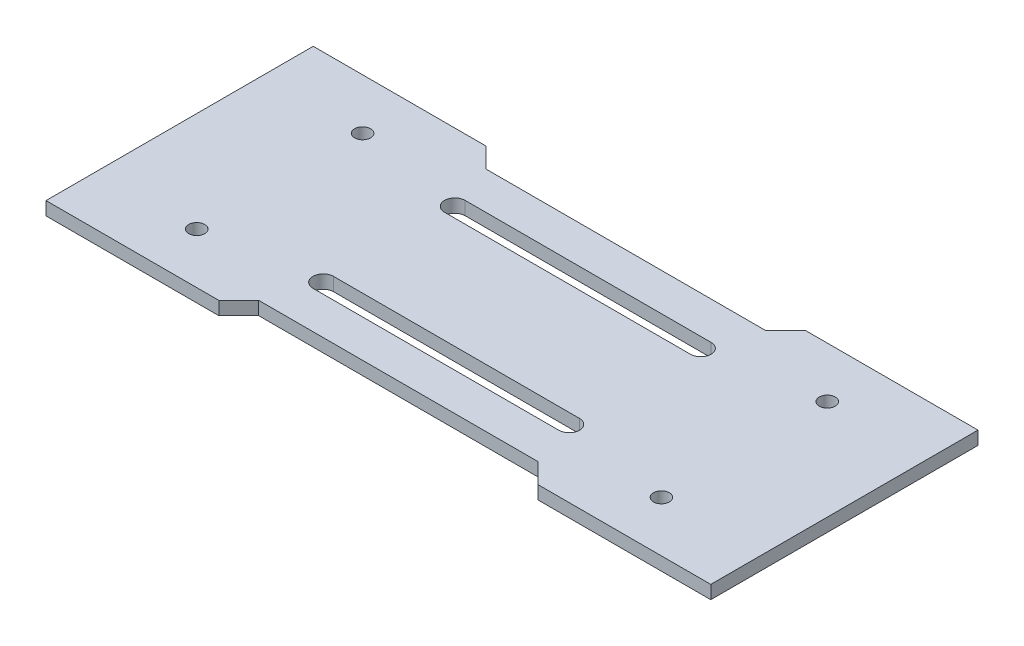
ISO-10303-21;
HEADER;
FILE_DESCRIPTION(('STEP AP214'),'2;1');
FILE_NAME('part.step','',(''),(''),'','','');
FILE_SCHEMA(('AUTOMOTIVE_DESIGN { 1 0 10303 214 1 1 1 1 }'));
ENDSEC;
DATA;
#1=APPLICATION_CONTEXT('core data for automotive mechanical design processes');
#2=APPLICATION_PROTOCOL_DEFINITION('international standard','automotive_design',2000,#1);
#3=PRODUCT_CONTEXT('',#1,'mechanical');
#4=PRODUCT('Part','Part','',(#3));
#5=PRODUCT_RELATED_PRODUCT_CATEGORY('part','',(#4));
#6=PRODUCT_DEFINITION_FORMATION('','',#4);
#7=PRODUCT_DEFINITION_CONTEXT('part definition',#1,'design');
#8=PRODUCT_DEFINITION('design','',#6,#7);
#9=PRODUCT_DEFINITION_SHAPE('','',#8);
#10=(LENGTH_UNIT() NAMED_UNIT(*) SI_UNIT(.MILLI.,.METRE.));
#11=(NAMED_UNIT(*) PLANE_ANGLE_UNIT() SI_UNIT($,.RADIAN.));
#12=(NAMED_UNIT(*) SI_UNIT($,.STERADIAN.) SOLID_ANGLE_UNIT());
#13=UNCERTAINTY_MEASURE_WITH_UNIT(LENGTH_MEASURE(1.E-05),#10,'distance_accuracy_value','');
#14=(GEOMETRIC_REPRESENTATION_CONTEXT(3) GLOBAL_UNCERTAINTY_ASSIGNED_CONTEXT((#13)) GLOBAL_UNIT_ASSIGNED_CONTEXT((#10,
#11,#12)) REPRESENTATION_CONTEXT('',''));
#15=CARTESIAN_POINT('',(0.,0.,0.));
#16=DIRECTION('',(0.,0.,1.));
#17=DIRECTION('',(1.,0.,0.));
#18=AXIS2_PLACEMENT_3D('',#15,#16,#17);
#19=CARTESIAN_POINT('',(-50.,1.,20.1));
#20=DIRECTION('',(0.,0.,-1.));
#21=DIRECTION('',(-1.,0.,0.));
#22=AXIS2_PLACEMENT_3D('',#19,#20,#21);
#23=PLANE('',#22);
#24=DIRECTION('',(1.,0.,0.));
#25=VECTOR('',#24,1.);
#26=CARTESIAN_POINT('',(-50.,-1.,20.1));
#27=LINE('',#26,#25);
#28=CARTESIAN_POINT('',(-50.,-1.,20.1));
#29=VERTEX_POINT('',#28);
#30=CARTESIAN_POINT('',(-24.,-1.,20.1));
#31=VERTEX_POINT('',#30);
#32=EDGE_CURVE('E190',#29,#31,#27,.T.);
#33=ORIENTED_EDGE('',*,*,#32,.T.);
#34=DIRECTION('',(0.,-1.,0.));
#35=VECTOR('',#34,1.);
#36=CARTESIAN_POINT('',(-24.,1.,20.1));
#37=LINE('',#36,#35);
#38=CARTESIAN_POINT('',(-24.,1.,20.1));
#39=VERTEX_POINT('',#38);
#40=EDGE_CURVE('E11',#39,#31,#37,.T.);
#41=ORIENTED_EDGE('',*,*,#40,.F.);
#42=DIRECTION('',(1.,0.,0.));
#43=VECTOR('',#42,1.);
#44=CARTESIAN_POINT('',(-50.,1.,20.1));
#45=LINE('',#44,#43);
#46=CARTESIAN_POINT('',(-50.,1.,20.1));
#47=VERTEX_POINT('',#46);
#48=EDGE_CURVE('E191',#47,#39,#45,.T.);
#49=ORIENTED_EDGE('',*,*,#48,.F.);
#50=DIRECTION('',(0.,-1.,0.));
#51=VECTOR('',#50,1.);
#52=CARTESIAN_POINT('',(-50.,1.,20.1));
#53=LINE('',#52,#51);
#54=EDGE_CURVE('E228',#47,#29,#53,.T.);
#55=ORIENTED_EDGE('',*,*,#54,.T.);
#56=EDGE_LOOP('',(#33,#41,#49,#55));
#57=FACE_BOUND('',#56,.T.);
#58=ADVANCED_FACE('F37',(#57),#23,.F.);
#59=CARTESIAN_POINT('',(-24.,1.,20.1));
#60=DIRECTION('',(-0.707106781186547,0.,-0.707106781186548));
#61=DIRECTION('',(-0.707106781186548,0.,0.707106781186547));
#62=AXIS2_PLACEMENT_3D('',#59,#60,#61);
#63=PLANE('',#62);
#64=DIRECTION('',(0.707106781186548,0.,-0.707106781186547));
#65=VECTOR('',#64,1.);
#66=CARTESIAN_POINT('',(-24.,-1.,20.1));
#67=LINE('',#66,#65);
#68=CARTESIAN_POINT('',(-21.,-1.,17.1));
#69=VERTEX_POINT('',#68);
#70=EDGE_CURVE('E91',#31,#69,#67,.T.);
#71=ORIENTED_EDGE('',*,*,#70,.T.);
#72=DIRECTION('',(0.,-1.,0.));
#73=VECTOR('',#72,1.);
#74=CARTESIAN_POINT('',(-21.,1.,17.1));
#75=LINE('',#74,#73);
#76=CARTESIAN_POINT('',(-21.,1.,17.1));
#77=VERTEX_POINT('',#76);
#78=EDGE_CURVE('E45',#77,#69,#75,.T.);
#79=ORIENTED_EDGE('',*,*,#78,.F.);
#80=DIRECTION('',(0.707106781186548,0.,-0.707106781186547));
#81=VECTOR('',#80,1.);
#82=CARTESIAN_POINT('',(-24.,1.,20.1));
#83=LINE('',#82,#81);
#84=EDGE_CURVE('E194',#39,#77,#83,.T.);
#85=ORIENTED_EDGE('',*,*,#84,.F.);
#86=ORIENTED_EDGE('',*,*,#40,.T.);
#87=EDGE_LOOP('',(#71,#79,#85,#86));
#88=FACE_BOUND('',#87,.T.);
#89=ADVANCED_FACE('F348',(#88),#63,.F.);
#90=CARTESIAN_POINT('',(-21.,1.,17.1));
#91=DIRECTION('',(0.,0.,-1.));
#92=DIRECTION('',(-1.,0.,0.));
#93=AXIS2_PLACEMENT_3D('',#90,#91,#92);
#94=PLANE('',#93);
#95=DIRECTION('',(1.,0.,0.));
#96=VECTOR('',#95,1.);
#97=CARTESIAN_POINT('',(-21.,-1.,17.1));
#98=LINE('',#97,#96);
#99=CARTESIAN_POINT('',(21.,-1.,17.1));
#100=VERTEX_POINT('',#99);
#101=EDGE_CURVE('E232',#69,#100,#98,.T.);
#102=ORIENTED_EDGE('',*,*,#101,.T.);
#103=DIRECTION('',(0.,-1.,0.));
#104=VECTOR('',#103,1.);
#105=CARTESIAN_POINT('',(21.,1.,17.1));
#106=LINE('',#105,#104);
#107=CARTESIAN_POINT('',(21.,1.,17.1));
#108=VERTEX_POINT('',#107);
#109=EDGE_CURVE('E277',#108,#100,#106,.T.);
#110=ORIENTED_EDGE('',*,*,#109,.F.);
#111=DIRECTION('',(1.,0.,0.));
#112=VECTOR('',#111,1.);
#113=CARTESIAN_POINT('',(-21.,1.,17.1));
#114=LINE('',#113,#112);
#115=EDGE_CURVE('E198',#77,#108,#114,.T.);
#116=ORIENTED_EDGE('',*,*,#115,.F.);
#117=ORIENTED_EDGE('',*,*,#78,.T.);
#118=EDGE_LOOP('',(#102,#110,#116,#117));
#119=FACE_BOUND('',#118,.T.);
#120=ADVANCED_FACE('F353',(#119),#94,.F.);
#121=CARTESIAN_POINT('',(21.,1.,17.1));
#122=DIRECTION('',(0.707106781186546,0.,-0.707106781186549));
#123=DIRECTION('',(-0.707106781186549,0.,-0.707106781186546));
#124=AXIS2_PLACEMENT_3D('',#121,#122,#123);
#125=PLANE('',#124);
#126=DIRECTION('',(0.707106781186549,0.,0.707106781186546));
#127=VECTOR('',#126,1.);
#128=CARTESIAN_POINT('',(21.,-1.,17.1));
#129=LINE('',#128,#127);
#130=CARTESIAN_POINT('',(24.,-1.,20.1));
#131=VERTEX_POINT('',#130);
#132=EDGE_CURVE('E234',#100,#131,#129,.T.);
#133=ORIENTED_EDGE('',*,*,#132,.T.);
#134=DIRECTION('',(0.,-1.,0.));
#135=VECTOR('',#134,1.);
#136=CARTESIAN_POINT('',(24.,1.,20.1));
#137=LINE('',#136,#135);
#138=CARTESIAN_POINT('',(24.,1.,20.1));
#139=VERTEX_POINT('',#138);
#140=EDGE_CURVE('E274',#139,#131,#137,.T.);
#141=ORIENTED_EDGE('',*,*,#140,.F.);
#142=DIRECTION('',(0.707106781186549,0.,0.707106781186546));
#143=VECTOR('',#142,1.);
#144=CARTESIAN_POINT('',(21.,1.,17.1));
#145=LINE('',#144,#143);
#146=EDGE_CURVE('E201',#108,#139,#145,.T.);
#147=ORIENTED_EDGE('',*,*,#146,.F.);
#148=ORIENTED_EDGE('',*,*,#109,.T.);
#149=EDGE_LOOP('',(#133,#141,#147,#148));
#150=FACE_BOUND('',#149,.T.);
#151=ADVANCED_FACE('F464',(#150),#125,.F.);
#152=CARTESIAN_POINT('',(24.,1.,20.1));
#153=DIRECTION('',(0.,0.,-1.));
#154=DIRECTION('',(-1.,0.,0.));
#155=AXIS2_PLACEMENT_3D('',#152,#153,#154);
#156=PLANE('',#155);
#157=DIRECTION('',(1.,0.,0.));
#158=VECTOR('',#157,1.);
#159=CARTESIAN_POINT('',(24.,-1.,20.1));
#160=LINE('',#159,#158);
#161=CARTESIAN_POINT('',(50.,-1.,20.1));
#162=VERTEX_POINT('',#161);
#163=EDGE_CURVE('E236',#131,#162,#160,.T.);
#164=ORIENTED_EDGE('',*,*,#163,.T.);
#165=DIRECTION('',(0.,-1.,0.));
#166=VECTOR('',#165,1.);
#167=CARTESIAN_POINT('',(50.,1.,20.1));
#168=LINE('',#167,#166);
#169=CARTESIAN_POINT('',(50.,1.,20.1));
#170=VERTEX_POINT('',#169);
#171=EDGE_CURVE('E271',#170,#162,#168,.T.);
#172=ORIENTED_EDGE('',*,*,#171,.F.);
#173=DIRECTION('',(1.,0.,0.));
#174=VECTOR('',#173,1.);
#175=CARTESIAN_POINT('',(24.,1.,20.1));
#176=LINE('',#175,#174);
#177=EDGE_CURVE('E204',#139,#170,#176,.T.);
#178=ORIENTED_EDGE('',*,*,#177,.F.);
#179=ORIENTED_EDGE('',*,*,#140,.T.);
#180=EDGE_LOOP('',(#164,#172,#178,#179));
#181=FACE_BOUND('',#180,.T.);
#182=ADVANCED_FACE('F460',(#181),#156,.F.);
#183=CARTESIAN_POINT('',(50.,1.,20.1));
#184=DIRECTION('',(-1.,0.,0.));
#185=DIRECTION('',(0.,0.,1.));
#186=AXIS2_PLACEMENT_3D('',#183,#184,#185);
#187=PLANE('',#186);
#188=DIRECTION('',(0.,0.,-1.));
#189=VECTOR('',#188,1.);
#190=CARTESIAN_POINT('',(50.,-1.,20.1));
#191=LINE('',#190,#189);
#192=CARTESIAN_POINT('',(50.,-1.,-20.1));
#193=VERTEX_POINT('',#192);
#194=EDGE_CURVE('E238',#162,#193,#191,.T.);
#195=ORIENTED_EDGE('',*,*,#194,.T.);
#196=DIRECTION('',(0.,-1.,0.));
#197=VECTOR('',#196,1.);
#198=CARTESIAN_POINT('',(50.,1.,-20.1));
#199=LINE('',#198,#197);
#200=CARTESIAN_POINT('',(50.,1.,-20.1));
#201=VERTEX_POINT('',#200);
#202=EDGE_CURVE('E268',#201,#193,#199,.T.);
#203=ORIENTED_EDGE('',*,*,#202,.F.);
#204=DIRECTION('',(0.,0.,-1.));
#205=VECTOR('',#204,1.);
#206=CARTESIAN_POINT('',(50.,1.,20.1));
#207=LINE('',#206,#205);
#208=EDGE_CURVE('E207',#170,#201,#207,.T.);
#209=ORIENTED_EDGE('',*,*,#208,.F.);
#210=ORIENTED_EDGE('',*,*,#171,.T.);
#211=EDGE_LOOP('',(#195,#203,#209,#210));
#212=FACE_BOUND('',#211,.T.);
#213=ADVANCED_FACE('F456',(#212),#187,.F.);
#214=CARTESIAN_POINT('',(50.,1.,-20.1));
#215=DIRECTION('',(0.,0.,1.));
#216=DIRECTION('',(1.,0.,0.));
#217=AXIS2_PLACEMENT_3D('',#214,#215,#216);
#218=PLANE('',#217);
#219=DIRECTION('',(-1.,0.,0.));
#220=VECTOR('',#219,1.);
#221=CARTESIAN_POINT('',(50.,-1.,-20.1));
#222=LINE('',#221,#220);
#223=CARTESIAN_POINT('',(24.,-1.,-20.1));
#224=VERTEX_POINT('',#223);
#225=EDGE_CURVE('E240',#193,#224,#222,.T.);
#226=ORIENTED_EDGE('',*,*,#225,.T.);
#227=DIRECTION('',(0.,-1.,0.));
#228=VECTOR('',#227,1.);
#229=CARTESIAN_POINT('',(24.,1.,-20.1));
#230=LINE('',#229,#228);
#231=CARTESIAN_POINT('',(24.,1.,-20.1));
#232=VERTEX_POINT('',#231);
#233=EDGE_CURVE('E265',#232,#224,#230,.T.);
#234=ORIENTED_EDGE('',*,*,#233,.F.);
#235=DIRECTION('',(-1.,0.,0.));
#236=VECTOR('',#235,1.);
#237=CARTESIAN_POINT('',(50.,1.,-20.1));
#238=LINE('',#237,#236);
#239=EDGE_CURVE('E210',#201,#232,#238,.T.);
#240=ORIENTED_EDGE('',*,*,#239,.F.);
#241=ORIENTED_EDGE('',*,*,#202,.T.);
#242=EDGE_LOOP('',(#226,#234,#240,#241));
#243=FACE_BOUND('',#242,.T.);
#244=ADVANCED_FACE('F452',(#243),#218,.F.);
#245=CARTESIAN_POINT('',(24.,1.,-20.1));
#246=DIRECTION('',(0.707106781186547,0.,0.707106781186548));
#247=DIRECTION('',(0.707106781186548,0.,-0.707106781186547));
#248=AXIS2_PLACEMENT_3D('',#245,#246,#247);
#249=PLANE('',#248);
#250=DIRECTION('',(-0.707106781186548,0.,0.707106781186547));
#251=VECTOR('',#250,1.);
#252=CARTESIAN_POINT('',(24.,-1.,-20.1));
#253=LINE('',#252,#251);
#254=CARTESIAN_POINT('',(21.,-1.,-17.1));
#255=VERTEX_POINT('',#254);
#256=EDGE_CURVE('E242',#224,#255,#253,.T.);
#257=ORIENTED_EDGE('',*,*,#256,.T.);
#258=DIRECTION('',(0.,-1.,0.));
#259=VECTOR('',#258,1.);
#260=CARTESIAN_POINT('',(21.,1.,-17.1));
#261=LINE('',#260,#259);
#262=CARTESIAN_POINT('',(21.,1.,-17.1));
#263=VERTEX_POINT('',#262);
#264=EDGE_CURVE('E262',#263,#255,#261,.T.);
#265=ORIENTED_EDGE('',*,*,#264,.F.);
#266=DIRECTION('',(-0.707106781186548,0.,0.707106781186547));
#267=VECTOR('',#266,1.);
#268=CARTESIAN_POINT('',(24.,1.,-20.1));
#269=LINE('',#268,#267);
#270=EDGE_CURVE('E213',#232,#263,#269,.T.);
#271=ORIENTED_EDGE('',*,*,#270,.F.);
#272=ORIENTED_EDGE('',*,*,#233,.T.);
#273=EDGE_LOOP('',(#257,#265,#271,#272));
#274=FACE_BOUND('',#273,.T.);
#275=ADVANCED_FACE('F448',(#274),#249,.F.);
#276=CARTESIAN_POINT('',(21.,1.,-17.1));
#277=DIRECTION('',(0.,0.,1.));
#278=DIRECTION('',(1.,0.,0.));
#279=AXIS2_PLACEMENT_3D('',#276,#277,#278);
#280=PLANE('',#279);
#281=DIRECTION('',(-1.,0.,0.));
#282=VECTOR('',#281,1.);
#283=CARTESIAN_POINT('',(21.,-1.,-17.1));
#284=LINE('',#283,#282);
#285=CARTESIAN_POINT('',(-21.,-1.,-17.1));
#286=VERTEX_POINT('',#285);
#287=EDGE_CURVE('E244',#255,#286,#284,.T.);
#288=ORIENTED_EDGE('',*,*,#287,.T.);
#289=DIRECTION('',(0.,-1.,0.));
#290=VECTOR('',#289,1.);
#291=CARTESIAN_POINT('',(-21.,1.,-17.1));
#292=LINE('',#291,#290);
#293=CARTESIAN_POINT('',(-21.,1.,-17.1));
#294=VERTEX_POINT('',#293);
#295=EDGE_CURVE('E259',#294,#286,#292,.T.);
#296=ORIENTED_EDGE('',*,*,#295,.F.);
#297=DIRECTION('',(-1.,0.,0.));
#298=VECTOR('',#297,1.);
#299=CARTESIAN_POINT('',(21.,1.,-17.1));
#300=LINE('',#299,#298);
#301=EDGE_CURVE('E216',#263,#294,#300,.T.);
#302=ORIENTED_EDGE('',*,*,#301,.F.);
#303=ORIENTED_EDGE('',*,*,#264,.T.);
#304=EDGE_LOOP('',(#288,#296,#302,#303));
#305=FACE_BOUND('',#304,.T.);
#306=ADVANCED_FACE('F444',(#305),#280,.F.);
#307=CARTESIAN_POINT('',(-21.,1.,-17.1));
#308=DIRECTION('',(-0.707106781186547,0.,0.707106781186548));
#309=DIRECTION('',(0.707106781186548,0.,0.707106781186547));
#310=AXIS2_PLACEMENT_3D('',#307,#308,#309);
#311=PLANE('',#310);
#312=DIRECTION('',(-0.707106781186548,0.,-0.707106781186547));
#313=VECTOR('',#312,1.);
#314=CARTESIAN_POINT('',(-21.,-1.,-17.1));
#315=LINE('',#314,#313);
#316=CARTESIAN_POINT('',(-24.,-1.,-20.1));
#317=VERTEX_POINT('',#316);
#318=EDGE_CURVE('E246',#286,#317,#315,.T.);
#319=ORIENTED_EDGE('',*,*,#318,.T.);
#320=DIRECTION('',(0.,-1.,0.));
#321=VECTOR('',#320,1.);
#322=CARTESIAN_POINT('',(-24.,1.,-20.1));
#323=LINE('',#322,#321);
#324=CARTESIAN_POINT('',(-24.,1.,-20.1));
#325=VERTEX_POINT('',#324);
#326=EDGE_CURVE('E256',#325,#317,#323,.T.);
#327=ORIENTED_EDGE('',*,*,#326,.F.);
#328=DIRECTION('',(-0.707106781186548,0.,-0.707106781186547));
#329=VECTOR('',#328,1.);
#330=CARTESIAN_POINT('',(-21.,1.,-17.1));
#331=LINE('',#330,#329);
#332=EDGE_CURVE('E219',#294,#325,#331,.T.);
#333=ORIENTED_EDGE('',*,*,#332,.F.);
#334=ORIENTED_EDGE('',*,*,#295,.T.);
#335=EDGE_LOOP('',(#319,#327,#333,#334));
#336=FACE_BOUND('',#335,.T.);
#337=ADVANCED_FACE('F441',(#336),#311,.F.);
#338=CARTESIAN_POINT('',(-24.,1.,-20.1));
#339=DIRECTION('',(0.,0.,1.));
#340=DIRECTION('',(1.,0.,0.));
#341=AXIS2_PLACEMENT_3D('',#338,#339,#340);
#342=PLANE('',#341);
#343=DIRECTION('',(-1.,0.,0.));
#344=VECTOR('',#343,1.);
#345=CARTESIAN_POINT('',(-24.,-1.,-20.1));
#346=LINE('',#345,#344);
#347=CARTESIAN_POINT('',(-50.,-1.,-20.1));
#348=VERTEX_POINT('',#347);
#349=EDGE_CURVE('E248',#317,#348,#346,.T.);
#350=ORIENTED_EDGE('',*,*,#349,.T.);
#351=DIRECTION('',(0.,-1.,0.));
#352=VECTOR('',#351,1.);
#353=CARTESIAN_POINT('',(-50.,1.,-20.1));
#354=LINE('',#353,#352);
#355=CARTESIAN_POINT('',(-50.,1.,-20.1));
#356=VERTEX_POINT('',#355);
#357=EDGE_CURVE('E253',#356,#348,#354,.T.);
#358=ORIENTED_EDGE('',*,*,#357,.F.);
#359=DIRECTION('',(-1.,0.,0.));
#360=VECTOR('',#359,1.);
#361=CARTESIAN_POINT('',(-24.,1.,-20.1));
#362=LINE('',#361,#360);
#363=EDGE_CURVE('E222',#325,#356,#362,.T.);
#364=ORIENTED_EDGE('',*,*,#363,.F.);
#365=ORIENTED_EDGE('',*,*,#326,.T.);
#366=EDGE_LOOP('',(#350,#358,#364,#365));
#367=FACE_BOUND('',#366,.T.);
#368=ADVANCED_FACE('F368',(#367),#342,.F.);
#369=CARTESIAN_POINT('',(-50.,1.,-20.1));
#370=DIRECTION('',(1.,0.,0.));
#371=DIRECTION('',(0.,0.,-1.));
#372=AXIS2_PLACEMENT_3D('',#369,#370,#371);
#373=PLANE('',#372);
#374=DIRECTION('',(0.,0.,1.));
#375=VECTOR('',#374,1.);
#376=CARTESIAN_POINT('',(-50.,-1.,-20.1));
#377=LINE('',#376,#375);
#378=EDGE_CURVE('E195',#348,#29,#377,.T.);
#379=ORIENTED_EDGE('',*,*,#378,.T.);
#380=ORIENTED_EDGE('',*,*,#54,.F.);
#381=DIRECTION('',(0.,0.,1.));
#382=VECTOR('',#381,1.);
#383=CARTESIAN_POINT('',(-50.,1.,-20.1));
#384=LINE('',#383,#382);
#385=EDGE_CURVE('E225',#356,#47,#384,.T.);
#386=ORIENTED_EDGE('',*,*,#385,.F.);
#387=ORIENTED_EDGE('',*,*,#357,.T.);
#388=EDGE_LOOP('',(#379,#380,#386,#387));
#389=FACE_BOUND('',#388,.T.);
#390=ADVANCED_FACE('F362',(#389),#373,.F.);
#391=CARTESIAN_POINT('',(0.,1.,0.));
#392=DIRECTION('',(0.,1.,0.));
#393=DIRECTION('',(0.,0.,1.));
#394=AXIS2_PLACEMENT_3D('',#391,#392,#393);
#395=PLANE('',#394);
#396=CARTESIAN_POINT('',(34.95,1.,12.475));
#397=DIRECTION('',(0.,1.,0.));
#398=DIRECTION('',(0.,0.,1.));
#399=AXIS2_PLACEMENT_3D('',#396,#397,#398);
#400=CIRCLE('',#399,1.2);
#401=CARTESIAN_POINT('',(34.95,1.,13.675));
#402=VERTEX_POINT('',#401);
#403=EDGE_CURVE('E184',#402,#402,#400,.T.);
#404=ORIENTED_EDGE('',*,*,#403,.F.);
#405=EDGE_LOOP('',(#404));
#406=FACE_BOUND('',#405,.T.);
#407=CARTESIAN_POINT('',(-34.95,1.,12.475));
#408=DIRECTION('',(0.,1.,0.));
#409=DIRECTION('',(0.,0.,1.));
#410=AXIS2_PLACEMENT_3D('',#407,#408,#409);
#411=CIRCLE('',#410,1.2);
#412=CARTESIAN_POINT('',(-34.95,1.,13.675));
#413=VERTEX_POINT('',#412);
#414=EDGE_CURVE('E179',#413,#413,#411,.T.);
#415=ORIENTED_EDGE('',*,*,#414,.F.);
#416=EDGE_LOOP('',(#415));
#417=FACE_BOUND('',#416,.T.);
#418=CARTESIAN_POINT('',(-34.95,1.,-12.475));
#419=DIRECTION('',(0.,1.,0.));
#420=DIRECTION('',(0.,0.,1.));
#421=AXIS2_PLACEMENT_3D('',#418,#419,#420);
#422=CIRCLE('',#421,1.2);
#423=CARTESIAN_POINT('',(-34.95,1.,-11.275));
#424=VERTEX_POINT('',#423);
#425=EDGE_CURVE('E174',#424,#424,#422,.T.);
#426=ORIENTED_EDGE('',*,*,#425,.F.);
#427=EDGE_LOOP('',(#426));
#428=FACE_BOUND('',#427,.T.);
#429=CARTESIAN_POINT('',(-18.5,1.,9.9));
#430=DIRECTION('',(0.,1.,0.));
#431=DIRECTION('',(0.,0.,1.));
#432=AXIS2_PLACEMENT_3D('',#429,#430,#431);
#433=CIRCLE('',#432,1.55);
#434=CARTESIAN_POINT('',(-18.5,1.,8.35));
#435=VERTEX_POINT('',#434);
#436=CARTESIAN_POINT('',(-18.5,1.,11.45));
#437=VERTEX_POINT('',#436);
#438=EDGE_CURVE('E40',#435,#437,#433,.T.);
#439=ORIENTED_EDGE('',*,*,#438,.F.);
#440=DIRECTION('',(-1.,0.,0.));
#441=VECTOR('',#440,1.);
#442=CARTESIAN_POINT('',(-18.5,1.,8.35));
#443=LINE('',#442,#441);
#444=CARTESIAN_POINT('',(18.5,1.,8.35));
#445=VERTEX_POINT('',#444);
#446=EDGE_CURVE('E82',#445,#435,#443,.T.);
#447=ORIENTED_EDGE('',*,*,#446,.F.);
#448=CARTESIAN_POINT('',(18.5,1.,9.9));
#449=DIRECTION('',(0.,1.,0.));
#450=DIRECTION('',(0.,0.,1.));
#451=AXIS2_PLACEMENT_3D('',#448,#449,#450);
#452=CIRCLE('',#451,1.55);
#453=CARTESIAN_POINT('',(18.5,1.,11.45));
#454=VERTEX_POINT('',#453);
#455=EDGE_CURVE('E173',#454,#445,#452,.T.);
#456=ORIENTED_EDGE('',*,*,#455,.F.);
#457=DIRECTION('',(1.,0.,0.));
#458=VECTOR('',#457,1.);
#459=CARTESIAN_POINT('',(-18.5,1.,11.45));
#460=LINE('',#459,#458);
#461=EDGE_CURVE('E168',#437,#454,#460,.T.);
#462=ORIENTED_EDGE('',*,*,#461,.F.);
#463=EDGE_LOOP('',(#439,#447,#456,#462));
#464=FACE_BOUND('',#463,.T.);
#465=CARTESIAN_POINT('',(34.95,1.,-12.475));
#466=DIRECTION('',(0.,1.,0.));
#467=DIRECTION('',(0.,0.,1.));
#468=AXIS2_PLACEMENT_3D('',#465,#466,#467);
#469=CIRCLE('',#468,1.2);
#470=CARTESIAN_POINT('',(34.95,1.,-11.275));
#471=VERTEX_POINT('',#470);
#472=EDGE_CURVE('E165',#471,#471,#469,.T.);
#473=ORIENTED_EDGE('',*,*,#472,.F.);
#474=EDGE_LOOP('',(#473));
#475=FACE_BOUND('',#474,.T.);
#476=CARTESIAN_POINT('',(-18.5,1.,-9.9));
#477=DIRECTION('',(0.,1.,0.));
#478=DIRECTION('',(0.,0.,1.));
#479=AXIS2_PLACEMENT_3D('',#476,#477,#478);
#480=CIRCLE('',#479,1.55);
#481=CARTESIAN_POINT('',(-18.5,1.,-11.45));
#482=VERTEX_POINT('',#481);
#483=CARTESIAN_POINT('',(-18.5,1.,-8.35));
#484=VERTEX_POINT('',#483);
#485=EDGE_CURVE('E153',#482,#484,#480,.T.);
#486=ORIENTED_EDGE('',*,*,#485,.F.);
#487=DIRECTION('',(-1.,0.,0.));
#488=VECTOR('',#487,1.);
#489=CARTESIAN_POINT('',(-18.5,1.,-11.45));
#490=LINE('',#489,#488);
#491=CARTESIAN_POINT('',(18.5,1.,-11.45));
#492=VERTEX_POINT('',#491);
#493=EDGE_CURVE('E144',#492,#482,#490,.T.);
#494=ORIENTED_EDGE('',*,*,#493,.F.);
#495=CARTESIAN_POINT('',(18.5,1.,-9.90000000000001));
#496=DIRECTION('',(0.,1.,0.));
#497=DIRECTION('',(0.,0.,1.));
#498=AXIS2_PLACEMENT_3D('',#495,#496,#497);
#499=CIRCLE('',#498,1.55);
#500=CARTESIAN_POINT('',(18.5,1.,-8.35));
#501=VERTEX_POINT('',#500);
#502=EDGE_CURVE('E138',#501,#492,#499,.T.);
#503=ORIENTED_EDGE('',*,*,#502,.F.);
#504=DIRECTION('',(1.,0.,0.));
#505=VECTOR('',#504,1.);
#506=CARTESIAN_POINT('',(-18.5,1.,-8.35));
#507=LINE('',#506,#505);
#508=EDGE_CURVE('E161',#484,#501,#507,.T.);
#509=ORIENTED_EDGE('',*,*,#508,.F.);
#510=EDGE_LOOP('',(#486,#494,#503,#509));
#511=FACE_BOUND('',#510,.T.);
#512=ORIENTED_EDGE('',*,*,#48,.T.);
#513=ORIENTED_EDGE('',*,*,#84,.T.);
#514=ORIENTED_EDGE('',*,*,#115,.T.);
#515=ORIENTED_EDGE('',*,*,#146,.T.);
#516=ORIENTED_EDGE('',*,*,#177,.T.);
#517=ORIENTED_EDGE('',*,*,#208,.T.);
#518=ORIENTED_EDGE('',*,*,#239,.T.);
#519=ORIENTED_EDGE('',*,*,#270,.T.);
#520=ORIENTED_EDGE('',*,*,#301,.T.);
#521=ORIENTED_EDGE('',*,*,#332,.T.);
#522=ORIENTED_EDGE('',*,*,#363,.T.);
#523=ORIENTED_EDGE('',*,*,#385,.T.);
#524=EDGE_LOOP('',(#512,#513,#514,#515,#516,#517,#518,#519,#520,#521,#522,#523));
#525=FACE_BOUND('',#524,.T.);
#526=ADVANCED_FACE('F163',(#406,#417,#428,#464,#475,#511,#525),#395,.T.);
#527=CARTESIAN_POINT('',(0.,-1.,0.));
#528=DIRECTION('',(0.,1.,0.));
#529=DIRECTION('',(0.,0.,1.));
#530=AXIS2_PLACEMENT_3D('',#527,#528,#529);
#531=PLANE('',#530);
#532=CARTESIAN_POINT('',(34.95,-1.,12.475));
#533=DIRECTION('',(0.,1.,0.));
#534=DIRECTION('',(0.,0.,1.));
#535=AXIS2_PLACEMENT_3D('',#532,#533,#534);
#536=CIRCLE('',#535,1.2);
#537=CARTESIAN_POINT('',(34.95,-1.,13.675));
#538=VERTEX_POINT('',#537);
#539=EDGE_CURVE('E322',#538,#538,#536,.T.);
#540=ORIENTED_EDGE('',*,*,#539,.T.);
#541=EDGE_LOOP('',(#540));
#542=FACE_BOUND('',#541,.T.);
#543=CARTESIAN_POINT('',(-34.95,-1.,12.475));
#544=DIRECTION('',(0.,1.,0.));
#545=DIRECTION('',(0.,0.,1.));
#546=AXIS2_PLACEMENT_3D('',#543,#544,#545);
#547=CIRCLE('',#546,1.2);
#548=CARTESIAN_POINT('',(-34.95,-1.,13.675));
#549=VERTEX_POINT('',#548);
#550=EDGE_CURVE('E303',#549,#549,#547,.T.);
#551=ORIENTED_EDGE('',*,*,#550,.T.);
#552=EDGE_LOOP('',(#551));
#553=FACE_BOUND('',#552,.T.);
#554=CARTESIAN_POINT('',(-34.95,-1.,-12.475));
#555=DIRECTION('',(0.,1.,0.));
#556=DIRECTION('',(0.,0.,1.));
#557=AXIS2_PLACEMENT_3D('',#554,#555,#556);
#558=CIRCLE('',#557,1.2);
#559=CARTESIAN_POINT('',(-34.95,-1.,-11.275));
#560=VERTEX_POINT('',#559);
#561=EDGE_CURVE('E299',#560,#560,#558,.T.);
#562=ORIENTED_EDGE('',*,*,#561,.T.);
#563=EDGE_LOOP('',(#562));
#564=FACE_BOUND('',#563,.T.);
#565=DIRECTION('',(-1.,0.,0.));
#566=VECTOR('',#565,1.);
#567=CARTESIAN_POINT('',(-18.5,-1.,8.35));
#568=LINE('',#567,#566);
#569=CARTESIAN_POINT('',(18.5,-1.,8.35));
#570=VERTEX_POINT('',#569);
#571=CARTESIAN_POINT('',(-18.5,-1.,8.35));
#572=VERTEX_POINT('',#571);
#573=EDGE_CURVE('E309',#570,#572,#568,.T.);
#574=ORIENTED_EDGE('',*,*,#573,.T.);
#575=CARTESIAN_POINT('',(-18.5,-1.,9.9));
#576=DIRECTION('',(0.,1.,0.));
#577=DIRECTION('',(0.,0.,1.));
#578=AXIS2_PLACEMENT_3D('',#575,#576,#577);
#579=CIRCLE('',#578,1.55);
#580=CARTESIAN_POINT('',(-18.5,-1.,11.45));
#581=VERTEX_POINT('',#580);
#582=EDGE_CURVE('E302',#572,#581,#579,.T.);
#583=ORIENTED_EDGE('',*,*,#582,.T.);
#584=DIRECTION('',(1.,0.,0.));
#585=VECTOR('',#584,1.);
#586=CARTESIAN_POINT('',(-18.5,-1.,11.45));
#587=LINE('',#586,#585);
#588=CARTESIAN_POINT('',(18.5,-1.,11.45));
#589=VERTEX_POINT('',#588);
#590=EDGE_CURVE('E317',#581,#589,#587,.T.);
#591=ORIENTED_EDGE('',*,*,#590,.T.);
#592=CARTESIAN_POINT('',(18.5,-1.,9.9));
#593=DIRECTION('',(0.,1.,0.));
#594=DIRECTION('',(0.,0.,1.));
#595=AXIS2_PLACEMENT_3D('',#592,#593,#594);
#596=CIRCLE('',#595,1.55);
#597=EDGE_CURVE('E314',#589,#570,#596,.T.);
#598=ORIENTED_EDGE('',*,*,#597,.T.);
#599=EDGE_LOOP('',(#574,#583,#591,#598));
#600=FACE_BOUND('',#599,.T.);
#601=CARTESIAN_POINT('',(34.95,-1.,-12.475));
#602=DIRECTION('',(0.,1.,0.));
#603=DIRECTION('',(0.,0.,1.));
#604=AXIS2_PLACEMENT_3D('',#601,#602,#603);
#605=CIRCLE('',#604,1.2);
#606=CARTESIAN_POINT('',(34.95,-1.,-11.275));
#607=VERTEX_POINT('',#606);
#608=EDGE_CURVE('E325',#607,#607,#605,.T.);
#609=ORIENTED_EDGE('',*,*,#608,.T.);
#610=EDGE_LOOP('',(#609));
#611=FACE_BOUND('',#610,.T.);
#612=DIRECTION('',(-1.,0.,0.));
#613=VECTOR('',#612,1.);
#614=CARTESIAN_POINT('',(-18.5,-1.,-11.45));
#615=LINE('',#614,#613);
#616=CARTESIAN_POINT('',(18.5,-1.,-11.45));
#617=VERTEX_POINT('',#616);
#618=CARTESIAN_POINT('',(-18.5,-1.,-11.45));
#619=VERTEX_POINT('',#618);
#620=EDGE_CURVE('E290',#617,#619,#615,.T.);
#621=ORIENTED_EDGE('',*,*,#620,.T.);
#622=CARTESIAN_POINT('',(-18.5,-1.,-9.9));
#623=DIRECTION('',(0.,1.,0.));
#624=DIRECTION('',(0.,0.,1.));
#625=AXIS2_PLACEMENT_3D('',#622,#623,#624);
#626=CIRCLE('',#625,1.55);
#627=CARTESIAN_POINT('',(-18.5,-1.,-8.35));
#628=VERTEX_POINT('',#627);
#629=EDGE_CURVE('E159',#619,#628,#626,.T.);
#630=ORIENTED_EDGE('',*,*,#629,.T.);
#631=DIRECTION('',(1.,0.,0.));
#632=VECTOR('',#631,1.);
#633=CARTESIAN_POINT('',(-18.5,-1.,-8.35));
#634=LINE('',#633,#632);
#635=CARTESIAN_POINT('',(18.5,-1.,-8.35000000000001));
#636=VERTEX_POINT('',#635);
#637=EDGE_CURVE('E295',#628,#636,#634,.T.);
#638=ORIENTED_EDGE('',*,*,#637,.T.);
#639=CARTESIAN_POINT('',(18.5,-1.,-9.90000000000001));
#640=DIRECTION('',(0.,1.,0.));
#641=DIRECTION('',(0.,0.,1.));
#642=AXIS2_PLACEMENT_3D('',#639,#640,#641);
#643=CIRCLE('',#642,1.55);
#644=EDGE_CURVE('E288',#636,#617,#643,.T.);
#645=ORIENTED_EDGE('',*,*,#644,.T.);
#646=EDGE_LOOP('',(#621,#630,#638,#645));
#647=FACE_BOUND('',#646,.T.);
#648=ORIENTED_EDGE('',*,*,#32,.F.);
#649=ORIENTED_EDGE('',*,*,#378,.F.);
#650=ORIENTED_EDGE('',*,*,#349,.F.);
#651=ORIENTED_EDGE('',*,*,#318,.F.);
#652=ORIENTED_EDGE('',*,*,#287,.F.);
#653=ORIENTED_EDGE('',*,*,#256,.F.);
#654=ORIENTED_EDGE('',*,*,#225,.F.);
#655=ORIENTED_EDGE('',*,*,#194,.F.);
#656=ORIENTED_EDGE('',*,*,#163,.F.);
#657=ORIENTED_EDGE('',*,*,#132,.F.);
#658=ORIENTED_EDGE('',*,*,#101,.F.);
#659=ORIENTED_EDGE('',*,*,#70,.F.);
#660=EDGE_LOOP('',(#648,#649,#650,#651,#652,#653,#654,#655,#656,#657,#658,#659));
#661=FACE_BOUND('',#660,.T.);
#662=ADVANCED_FACE('F331',(#542,#553,#564,#600,#611,#647,#661),#531,.F.);
#663=CARTESIAN_POINT('',(-18.5,-1.,-9.9));
#664=DIRECTION('',(0.,1.,0.));
#665=DIRECTION('',(0.,0.,1.));
#666=AXIS2_PLACEMENT_3D('',#663,#664,#665);
#667=CYLINDRICAL_SURFACE('',#666,1.55);
#668=ORIENTED_EDGE('',*,*,#485,.T.);
#669=DIRECTION('',(0.,1.,0.));
#670=VECTOR('',#669,1.);
#671=CARTESIAN_POINT('',(-18.5,-1.,-8.35));
#672=LINE('',#671,#670);
#673=EDGE_CURVE('E62',#628,#484,#672,.T.);
#674=ORIENTED_EDGE('',*,*,#673,.F.);
#675=ORIENTED_EDGE('',*,*,#629,.F.);
#676=DIRECTION('',(0.,1.,0.));
#677=VECTOR('',#676,1.);
#678=CARTESIAN_POINT('',(-18.5,-1.,-11.45));
#679=LINE('',#678,#677);
#680=EDGE_CURVE('E148',#619,#482,#679,.T.);
#681=ORIENTED_EDGE('',*,*,#680,.T.);
#682=EDGE_LOOP('',(#668,#674,#675,#681));
#683=FACE_BOUND('',#682,.T.);
#684=ADVANCED_FACE('F156',(#683),#667,.F.);
#685=CARTESIAN_POINT('',(-18.5,-1.,-11.45));
#686=DIRECTION('',(0.,0.,-1.));
#687=DIRECTION('',(-1.,0.,0.));
#688=AXIS2_PLACEMENT_3D('',#685,#686,#687);
#689=PLANE('',#688);
#690=ORIENTED_EDGE('',*,*,#493,.T.);
#691=ORIENTED_EDGE('',*,*,#680,.F.);
#692=ORIENTED_EDGE('',*,*,#620,.F.);
#693=DIRECTION('',(0.,1.,0.));
#694=VECTOR('',#693,1.);
#695=CARTESIAN_POINT('',(18.5,-1.,-11.45));
#696=LINE('',#695,#694);
#697=EDGE_CURVE('E150',#617,#492,#696,.T.);
#698=ORIENTED_EDGE('',*,*,#697,.T.);
#699=EDGE_LOOP('',(#690,#691,#692,#698));
#700=FACE_BOUND('',#699,.T.);
#701=ADVANCED_FACE('F146',(#700),#689,.F.);
#702=CARTESIAN_POINT('',(18.5,-1.,-9.90000000000001));
#703=DIRECTION('',(0.,1.,0.));
#704=DIRECTION('',(0.,0.,1.));
#705=AXIS2_PLACEMENT_3D('',#702,#703,#704);
#706=CYLINDRICAL_SURFACE('',#705,1.55);
#707=ORIENTED_EDGE('',*,*,#502,.T.);
#708=ORIENTED_EDGE('',*,*,#697,.F.);
#709=ORIENTED_EDGE('',*,*,#644,.F.);
#710=DIRECTION('',(0.,1.,0.));
#711=VECTOR('',#710,1.);
#712=CARTESIAN_POINT('',(18.5,-1.,-8.35));
#713=LINE('',#712,#711);
#714=EDGE_CURVE('E284',#636,#501,#713,.T.);
#715=ORIENTED_EDGE('',*,*,#714,.T.);
#716=EDGE_LOOP('',(#707,#708,#709,#715));
#717=FACE_BOUND('',#716,.T.);
#718=ADVANCED_FACE('F286',(#717),#706,.F.);
#719=CARTESIAN_POINT('',(-18.5,-1.,-8.35));
#720=DIRECTION('',(0.,0.,1.));
#721=DIRECTION('',(1.,0.,0.));
#722=AXIS2_PLACEMENT_3D('',#719,#720,#721);
#723=PLANE('',#722);
#724=ORIENTED_EDGE('',*,*,#508,.T.);
#725=ORIENTED_EDGE('',*,*,#714,.F.);
#726=ORIENTED_EDGE('',*,*,#637,.F.);
#727=ORIENTED_EDGE('',*,*,#673,.T.);
#728=EDGE_LOOP('',(#724,#725,#726,#727));
#729=FACE_BOUND('',#728,.T.);
#730=ADVANCED_FACE('F283',(#729),#723,.F.);
#731=CARTESIAN_POINT('',(34.95,-1.,-12.475));
#732=DIRECTION('',(0.,1.,0.));
#733=DIRECTION('',(0.,0.,1.));
#734=AXIS2_PLACEMENT_3D('',#731,#732,#733);
#735=CYLINDRICAL_SURFACE('',#734,1.2);
#736=ORIENTED_EDGE('',*,*,#472,.T.);
#737=EDGE_LOOP('',(#736));
#738=FACE_BOUND('',#737,.T.);
#739=ORIENTED_EDGE('',*,*,#608,.F.);
#740=EDGE_LOOP('',(#739));
#741=FACE_BOUND('',#740,.T.);
#742=ADVANCED_FACE('F334',(#738,#741),#735,.F.);
#743=CARTESIAN_POINT('',(-18.5,-1.,9.9));
#744=DIRECTION('',(0.,1.,0.));
#745=DIRECTION('',(0.,0.,1.));
#746=AXIS2_PLACEMENT_3D('',#743,#744,#745);
#747=CYLINDRICAL_SURFACE('',#746,1.55);
#748=ORIENTED_EDGE('',*,*,#438,.T.);
#749=DIRECTION('',(0.,1.,0.));
#750=VECTOR('',#749,1.);
#751=CARTESIAN_POINT('',(-18.5,-1.,11.45));
#752=LINE('',#751,#750);
#753=EDGE_CURVE('E53',#581,#437,#752,.T.);
#754=ORIENTED_EDGE('',*,*,#753,.F.);
#755=ORIENTED_EDGE('',*,*,#582,.F.);
#756=DIRECTION('',(0.,1.,0.));
#757=VECTOR('',#756,1.);
#758=CARTESIAN_POINT('',(-18.5,-1.,8.35));
#759=LINE('',#758,#757);
#760=EDGE_CURVE('E298',#572,#435,#759,.T.);
#761=ORIENTED_EDGE('',*,*,#760,.T.);
#762=EDGE_LOOP('',(#748,#754,#755,#761));
#763=FACE_BOUND('',#762,.T.);
#764=ADVANCED_FACE('F336',(#763),#747,.F.);
#765=CARTESIAN_POINT('',(-18.5,-1.,8.35));
#766=DIRECTION('',(0.,0.,-1.));
#767=DIRECTION('',(-1.,0.,0.));
#768=AXIS2_PLACEMENT_3D('',#765,#766,#767);
#769=PLANE('',#768);
#770=ORIENTED_EDGE('',*,*,#446,.T.);
#771=ORIENTED_EDGE('',*,*,#760,.F.);
#772=ORIENTED_EDGE('',*,*,#573,.F.);
#773=DIRECTION('',(0.,1.,0.));
#774=VECTOR('',#773,1.);
#775=CARTESIAN_POINT('',(18.5,-1.,8.35));
#776=LINE('',#775,#774);
#777=EDGE_CURVE('E307',#570,#445,#776,.T.);
#778=ORIENTED_EDGE('',*,*,#777,.T.);
#779=EDGE_LOOP('',(#770,#771,#772,#778));
#780=FACE_BOUND('',#779,.T.);
#781=ADVANCED_FACE('F343',(#780),#769,.F.);
#782=CARTESIAN_POINT('',(18.5,-1.,9.9));
#783=DIRECTION('',(0.,1.,0.));
#784=DIRECTION('',(0.,0.,1.));
#785=AXIS2_PLACEMENT_3D('',#782,#783,#784);
#786=CYLINDRICAL_SURFACE('',#785,1.55);
#787=ORIENTED_EDGE('',*,*,#455,.T.);
#788=ORIENTED_EDGE('',*,*,#777,.F.);
#789=ORIENTED_EDGE('',*,*,#597,.F.);
#790=DIRECTION('',(0.,1.,0.));
#791=VECTOR('',#790,1.);
#792=CARTESIAN_POINT('',(18.5,-1.,11.45));
#793=LINE('',#792,#791);
#794=EDGE_CURVE('E304',#589,#454,#793,.T.);
#795=ORIENTED_EDGE('',*,*,#794,.T.);
#796=EDGE_LOOP('',(#787,#788,#789,#795));
#797=FACE_BOUND('',#796,.T.);
#798=ADVANCED_FACE('F410',(#797),#786,.F.);
#799=CARTESIAN_POINT('',(-18.5,-1.,11.45));
#800=DIRECTION('',(0.,0.,1.));
#801=DIRECTION('',(1.,0.,0.));
#802=AXIS2_PLACEMENT_3D('',#799,#800,#801);
#803=PLANE('',#802);
#804=ORIENTED_EDGE('',*,*,#461,.T.);
#805=ORIENTED_EDGE('',*,*,#794,.F.);
#806=ORIENTED_EDGE('',*,*,#590,.F.);
#807=ORIENTED_EDGE('',*,*,#753,.T.);
#808=EDGE_LOOP('',(#804,#805,#806,#807));
#809=FACE_BOUND('',#808,.T.);
#810=ADVANCED_FACE('F403',(#809),#803,.F.);
#811=CARTESIAN_POINT('',(-34.95,-1.,-12.475));
#812=DIRECTION('',(0.,1.,0.));
#813=DIRECTION('',(0.,0.,1.));
#814=AXIS2_PLACEMENT_3D('',#811,#812,#813);
#815=CYLINDRICAL_SURFACE('',#814,1.2);
#816=ORIENTED_EDGE('',*,*,#425,.T.);
#817=EDGE_LOOP('',(#816));
#818=FACE_BOUND('',#817,.T.);
#819=ORIENTED_EDGE('',*,*,#561,.F.);
#820=EDGE_LOOP('',(#819));
#821=FACE_BOUND('',#820,.T.);
#822=ADVANCED_FACE('F417',(#818,#821),#815,.F.);
#823=CARTESIAN_POINT('',(-34.95,-1.,12.475));
#824=DIRECTION('',(0.,1.,0.));
#825=DIRECTION('',(0.,0.,1.));
#826=AXIS2_PLACEMENT_3D('',#823,#824,#825);
#827=CYLINDRICAL_SURFACE('',#826,1.2);
#828=ORIENTED_EDGE('',*,*,#414,.T.);
#829=EDGE_LOOP('',(#828));
#830=FACE_BOUND('',#829,.T.);
#831=ORIENTED_EDGE('',*,*,#550,.F.);
#832=EDGE_LOOP('',(#831));
#833=FACE_BOUND('',#832,.T.);
#834=ADVANCED_FACE('F424',(#830,#833),#827,.F.);
#835=CARTESIAN_POINT('',(34.95,-1.,12.475));
#836=DIRECTION('',(0.,1.,0.));
#837=DIRECTION('',(0.,0.,1.));
#838=AXIS2_PLACEMENT_3D('',#835,#836,#837);
#839=CYLINDRICAL_SURFACE('',#838,1.2);
#840=ORIENTED_EDGE('',*,*,#403,.T.);
#841=EDGE_LOOP('',(#840));
#842=FACE_BOUND('',#841,.T.);
#843=ORIENTED_EDGE('',*,*,#539,.F.);
#844=EDGE_LOOP('',(#843));
#845=FACE_BOUND('',#844,.T.);
#846=ADVANCED_FACE('F585',(#842,#845),#839,.F.);
#847=CLOSED_SHELL('',(#58,#89,#120,#151,#182,#213,#244,#275,#306,#337,#368,#390,#526,#662,#684,
#701,#718,#730,#742,#764,#781,#798,#810,#822,#834,#846));
#848=MANIFOLD_SOLID_BREP('B2',#847);
#849=ADVANCED_BREP_SHAPE_REPRESENTATION('',(#18,#848),#14);
#850=SHAPE_DEFINITION_REPRESENTATION(#9,#849);
ENDSEC;
END-ISO-10303-21;
